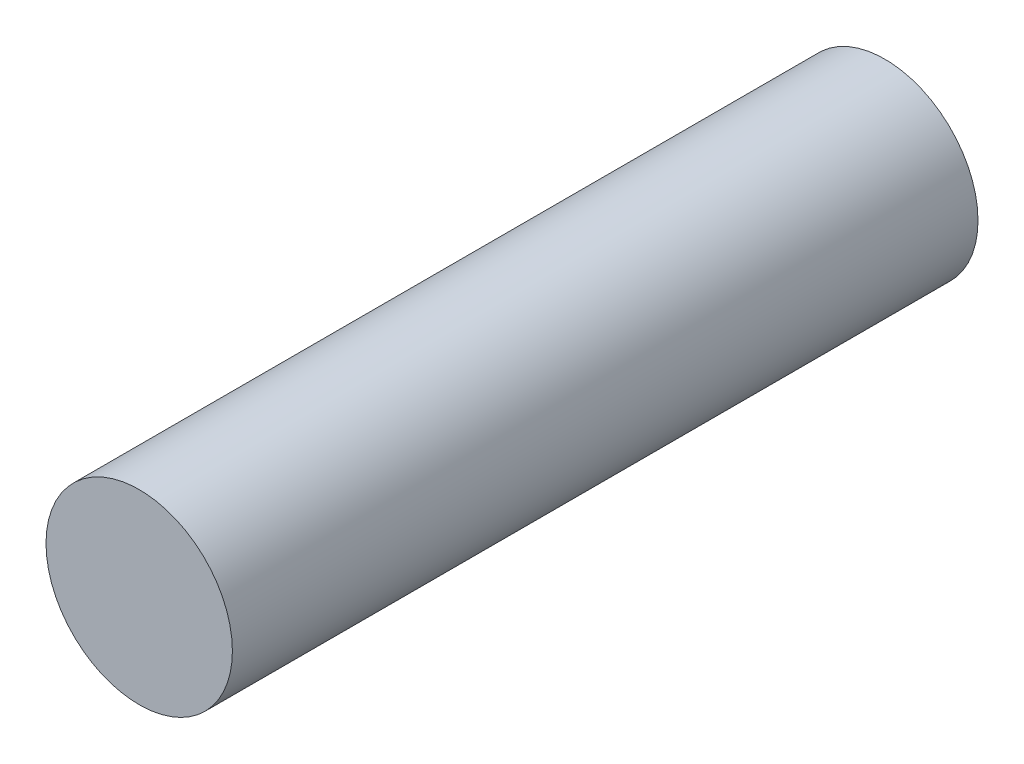
ISO-10303-21;
HEADER;
FILE_DESCRIPTION(('STEP AP214'),'2;1');
FILE_NAME('part.step','',(''),(''),'','','');
FILE_SCHEMA(('AUTOMOTIVE_DESIGN { 1 0 10303 214 1 1 1 1 }'));
ENDSEC;
DATA;
#1=APPLICATION_CONTEXT('core data for automotive mechanical design processes');
#2=APPLICATION_PROTOCOL_DEFINITION('international standard','automotive_design',2000,#1);
#3=PRODUCT_CONTEXT('',#1,'mechanical');
#4=PRODUCT('Part','Part','',(#3));
#5=PRODUCT_RELATED_PRODUCT_CATEGORY('part','',(#4));
#6=PRODUCT_DEFINITION_FORMATION('','',#4);
#7=PRODUCT_DEFINITION_CONTEXT('part definition',#1,'design');
#8=PRODUCT_DEFINITION('design','',#6,#7);
#9=PRODUCT_DEFINITION_SHAPE('','',#8);
#10=(LENGTH_UNIT() NAMED_UNIT(*) SI_UNIT(.MILLI.,.METRE.));
#11=(NAMED_UNIT(*) PLANE_ANGLE_UNIT() SI_UNIT($,.RADIAN.));
#12=(NAMED_UNIT(*) SI_UNIT($,.STERADIAN.) SOLID_ANGLE_UNIT());
#13=UNCERTAINTY_MEASURE_WITH_UNIT(LENGTH_MEASURE(1.E-05),#10,'distance_accuracy_value','');
#14=(GEOMETRIC_REPRESENTATION_CONTEXT(3) GLOBAL_UNCERTAINTY_ASSIGNED_CONTEXT((#13)) GLOBAL_UNIT_ASSIGNED_CONTEXT((#10,
#11,#12)) REPRESENTATION_CONTEXT('',''));
#15=CARTESIAN_POINT('',(0.,0.,0.));
#16=DIRECTION('',(0.,0.,1.));
#17=DIRECTION('',(1.,0.,0.));
#18=AXIS2_PLACEMENT_3D('',#15,#16,#17);
#19=CARTESIAN_POINT('',(-4.21850591840234,-4.83412378495954,23.));
#20=DIRECTION('',(0.,0.,-1.));
#21=DIRECTION('',(-1.,0.,0.));
#22=AXIS2_PLACEMENT_3D('',#19,#20,#21);
#23=PLANE('',#22);
#24=CARTESIAN_POINT('',(-4.21850591840234,-4.83412378495956,23.));
#25=DIRECTION('',(0.,0.,-1.));
#26=DIRECTION('',(-1.,0.,0.));
#27=AXIS2_PLACEMENT_3D('',#24,#25,#26);
#28=CIRCLE('',#27,2.5);
#29=CARTESIAN_POINT('',(-1.71850591840235,-4.83412378495956,23.));
#30=VERTEX_POINT('',#29);
#31=EDGE_CURVE('E56',#30,#30,#28,.T.);
#32=ORIENTED_EDGE('',*,*,#31,.F.);
#33=EDGE_LOOP('',(#32));
#34=FACE_BOUND('',#33,.T.);
#35=ADVANCED_FACE('F16',(#34),#23,.F.);
#36=CARTESIAN_POINT('',(-5.28903895258101,-7.65985027119568,21.));
#37=DIRECTION('',(0.,0.,1.));
#38=DIRECTION('',(-1.,0.,0.));
#39=AXIS2_PLACEMENT_3D('',#36,#37,#38);
#40=PLANE('',#39);
#41=CARTESIAN_POINT('',(-4.21850591840234,-4.83412378495956,21.));
#42=DIRECTION('',(0.,0.,1.));
#43=DIRECTION('',(-1.,0.,0.));
#44=AXIS2_PLACEMENT_3D('',#41,#42,#43);
#45=CIRCLE('',#44,2.5);
#46=CARTESIAN_POINT('',(-5.71850591840234,-6.83412378495956,21.));
#47=VERTEX_POINT('',#46);
#48=CARTESIAN_POINT('',(-2.71850591840234,-6.83412378495956,21.));
#49=VERTEX_POINT('',#48);
#50=EDGE_CURVE('E49',#47,#49,#45,.T.);
#51=ORIENTED_EDGE('',*,*,#50,.F.);
#52=DIRECTION('',(-1.,0.,0.));
#53=VECTOR('',#52,1.);
#54=CARTESIAN_POINT('',(-4.21850591840234,-6.83412378495956,21.));
#55=LINE('',#54,#53);
#56=EDGE_CURVE('E10',#49,#47,#55,.T.);
#57=ORIENTED_EDGE('',*,*,#56,.F.);
#58=EDGE_LOOP('',(#51,#57));
#59=FACE_BOUND('',#58,.T.);
#60=ADVANCED_FACE('F82',(#59),#40,.F.);
#61=CARTESIAN_POINT('',(-2.14135973441071,-6.83412378495956,3.));
#62=DIRECTION('',(0.,1.,0.));
#63=DIRECTION('',(-1.,0.,0.));
#64=AXIS2_PLACEMENT_3D('',#61,#62,#63);
#65=PLANE('',#64);
#66=DIRECTION('',(0.,0.,1.));
#67=VECTOR('',#66,1.);
#68=CARTESIAN_POINT('',(-5.71850591840234,-6.83412378495956,25.));
#69=LINE('',#68,#67);
#70=CARTESIAN_POINT('',(-5.71850591840237,-6.83412378495956,3.));
#71=VERTEX_POINT('',#70);
#72=EDGE_CURVE('E59',#71,#47,#69,.T.);
#73=ORIENTED_EDGE('',*,*,#72,.F.);
#74=DIRECTION('',(-1.,0.,0.));
#75=VECTOR('',#74,1.);
#76=CARTESIAN_POINT('',(-3.17993282640654,-6.83412378495956,3.));
#77=LINE('',#76,#75);
#78=CARTESIAN_POINT('',(-2.71850591840237,-6.83412378495956,3.));
#79=VERTEX_POINT('',#78);
#80=EDGE_CURVE('E54',#79,#71,#77,.T.);
#81=ORIENTED_EDGE('',*,*,#80,.F.);
#82=DIRECTION('',(0.,0.,-1.));
#83=VECTOR('',#82,1.);
#84=CARTESIAN_POINT('',(-2.71850591840234,-6.83412378495956,25.));
#85=LINE('',#84,#83);
#86=EDGE_CURVE('E24',#49,#79,#85,.T.);
#87=ORIENTED_EDGE('',*,*,#86,.F.);
#88=ORIENTED_EDGE('',*,*,#56,.T.);
#89=EDGE_LOOP('',(#73,#81,#87,#88));
#90=FACE_BOUND('',#89,.T.);
#91=ADVANCED_FACE('F58',(#90),#65,.F.);
#92=CARTESIAN_POINT('',(-4.21850591840234,-4.83412378495956,25.));
#93=DIRECTION('',(0.,0.,1.));
#94=DIRECTION('',(-1.,0.,0.));
#95=AXIS2_PLACEMENT_3D('',#92,#93,#94);
#96=CYLINDRICAL_SURFACE('',#95,2.5);
#97=ORIENTED_EDGE('',*,*,#72,.T.);
#98=ORIENTED_EDGE('',*,*,#50,.T.);
#99=ORIENTED_EDGE('',*,*,#86,.T.);
#100=CARTESIAN_POINT('',(-4.21850591840237,-4.83412378495956,3.));
#101=DIRECTION('',(0.,0.,-1.));
#102=DIRECTION('',(-1.,0.,0.));
#103=AXIS2_PLACEMENT_3D('',#100,#101,#102);
#104=CIRCLE('',#103,2.5);
#105=EDGE_CURVE('E47',#71,#79,#104,.T.);
#106=ORIENTED_EDGE('',*,*,#105,.F.);
#107=EDGE_LOOP('',(#97,#98,#99,#106));
#108=FACE_BOUND('',#107,.T.);
#109=ORIENTED_EDGE('',*,*,#31,.T.);
#110=EDGE_LOOP('',(#109));
#111=FACE_BOUND('',#110,.T.);
#112=ADVANCED_FACE('F45',(#108,#111),#96,.T.);
#113=CARTESIAN_POINT('',(-4.21850591840237,-4.83412378495957,3.));
#114=DIRECTION('',(0.,0.,-1.));
#115=DIRECTION('',(1.,0.,0.));
#116=AXIS2_PLACEMENT_3D('',#113,#114,#115);
#117=PLANE('',#116);
#118=ORIENTED_EDGE('',*,*,#80,.T.);
#119=ORIENTED_EDGE('',*,*,#105,.T.);
#120=EDGE_LOOP('',(#118,#119));
#121=FACE_BOUND('',#120,.T.);
#122=ADVANCED_FACE('F53',(#121),#117,.T.);
#123=CLOSED_SHELL('',(#35,#60,#91,#112,#122));
#124=MANIFOLD_SOLID_BREP('B1',#123);
#125=ADVANCED_BREP_SHAPE_REPRESENTATION('',(#18,#124),#14);
#126=SHAPE_DEFINITION_REPRESENTATION(#9,#125);
ENDSEC;
END-ISO-10303-21;
